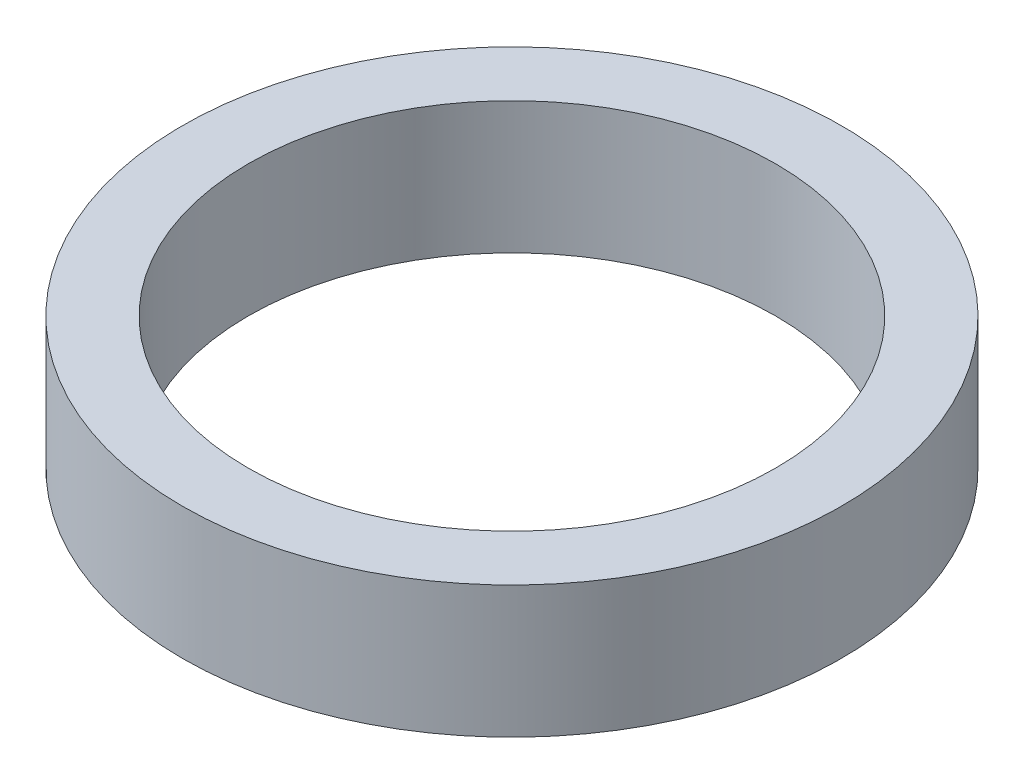
ISO-10303-21;
HEADER;
FILE_DESCRIPTION(('STEP AP214'),'2;1');
FILE_NAME('part.step','',(''),(''),'','','');
FILE_SCHEMA(('AUTOMOTIVE_DESIGN { 1 0 10303 214 1 1 1 1 }'));
ENDSEC;
DATA;
#1=APPLICATION_CONTEXT('core data for automotive mechanical design processes');
#2=APPLICATION_PROTOCOL_DEFINITION('international standard','automotive_design',2000,#1);
#3=PRODUCT_CONTEXT('',#1,'mechanical');
#4=PRODUCT('Part','Part','',(#3));
#5=PRODUCT_RELATED_PRODUCT_CATEGORY('part','',(#4));
#6=PRODUCT_DEFINITION_FORMATION('','',#4);
#7=PRODUCT_DEFINITION_CONTEXT('part definition',#1,'design');
#8=PRODUCT_DEFINITION('design','',#6,#7);
#9=PRODUCT_DEFINITION_SHAPE('','',#8);
#10=(LENGTH_UNIT() NAMED_UNIT(*) SI_UNIT(.MILLI.,.METRE.));
#11=(NAMED_UNIT(*) PLANE_ANGLE_UNIT() SI_UNIT($,.RADIAN.));
#12=(NAMED_UNIT(*) SI_UNIT($,.STERADIAN.) SOLID_ANGLE_UNIT());
#13=UNCERTAINTY_MEASURE_WITH_UNIT(LENGTH_MEASURE(1.E-05),#10,'distance_accuracy_value','');
#14=(GEOMETRIC_REPRESENTATION_CONTEXT(3) GLOBAL_UNCERTAINTY_ASSIGNED_CONTEXT((#13)) GLOBAL_UNIT_ASSIGNED_CONTEXT((#10,
#11,#12)) REPRESENTATION_CONTEXT('',''));
#15=CARTESIAN_POINT('',(0.,0.,0.));
#16=DIRECTION('',(0.,0.,1.));
#17=DIRECTION('',(1.,0.,0.));
#18=AXIS2_PLACEMENT_3D('',#15,#16,#17);
#19=CARTESIAN_POINT('',(0.,50.,200.));
#20=DIRECTION('',(0.,1.,0.));
#21=DIRECTION('',(0.,0.,1.));
#22=AXIS2_PLACEMENT_3D('',#19,#20,#21);
#23=PLANE('',#22);
#24=CARTESIAN_POINT('',(0.,50.,0.));
#25=DIRECTION('',(0.,1.,0.));
#26=DIRECTION('',(0.,0.,1.));
#27=AXIS2_PLACEMENT_3D('',#24,#25,#26);
#28=CIRCLE('',#27,250.);
#29=CARTESIAN_POINT('',(0.,50.,250.));
#30=VERTEX_POINT('',#29);
#31=EDGE_CURVE('E10',#30,#30,#28,.T.);
#32=ORIENTED_EDGE('',*,*,#31,.T.);
#33=EDGE_LOOP('',(#32));
#34=FACE_BOUND('',#33,.T.);
#35=CARTESIAN_POINT('',(0.,50.,0.));
#36=DIRECTION('',(0.,1.,0.));
#37=DIRECTION('',(0.,0.,1.));
#38=AXIS2_PLACEMENT_3D('',#35,#36,#37);
#39=CIRCLE('',#38,200.);
#40=CARTESIAN_POINT('',(0.,50.,200.));
#41=VERTEX_POINT('',#40);
#42=EDGE_CURVE('E54',#41,#41,#39,.T.);
#43=ORIENTED_EDGE('',*,*,#42,.F.);
#44=EDGE_LOOP('',(#43));
#45=FACE_BOUND('',#44,.T.);
#46=ADVANCED_FACE('F37',(#34,#45),#23,.T.);
#47=CARTESIAN_POINT('',(0.,174.427480916031,0.));
#48=DIRECTION('',(0.,1.,0.));
#49=DIRECTION('',(0.,0.,1.));
#50=AXIS2_PLACEMENT_3D('',#47,#48,#49);
#51=CYLINDRICAL_SURFACE('',#50,250.);
#52=CARTESIAN_POINT('',(0.,-50.,0.));
#53=DIRECTION('',(0.,1.,0.));
#54=DIRECTION('',(0.,0.,1.));
#55=AXIS2_PLACEMENT_3D('',#52,#53,#54);
#56=CIRCLE('',#55,250.);
#57=CARTESIAN_POINT('',(0.,-50.,250.));
#58=VERTEX_POINT('',#57);
#59=EDGE_CURVE('E44',#58,#58,#56,.T.);
#60=ORIENTED_EDGE('',*,*,#59,.T.);
#61=EDGE_LOOP('',(#60));
#62=FACE_BOUND('',#61,.T.);
#63=ORIENTED_EDGE('',*,*,#31,.F.);
#64=EDGE_LOOP('',(#63));
#65=FACE_BOUND('',#64,.T.);
#66=ADVANCED_FACE('F65',(#62,#65),#51,.T.);
#67=CARTESIAN_POINT('',(0.,-50.,250.));
#68=DIRECTION('',(0.,-1.,0.));
#69=DIRECTION('',(0.,0.,-1.));
#70=AXIS2_PLACEMENT_3D('',#67,#68,#69);
#71=PLANE('',#70);
#72=CARTESIAN_POINT('',(0.,-50.,0.));
#73=DIRECTION('',(0.,1.,0.));
#74=DIRECTION('',(0.,0.,1.));
#75=AXIS2_PLACEMENT_3D('',#72,#73,#74);
#76=CIRCLE('',#75,200.);
#77=CARTESIAN_POINT('',(0.,-50.,200.));
#78=VERTEX_POINT('',#77);
#79=EDGE_CURVE('E49',#78,#78,#76,.T.);
#80=ORIENTED_EDGE('',*,*,#79,.T.);
#81=EDGE_LOOP('',(#80));
#82=FACE_BOUND('',#81,.T.);
#83=ORIENTED_EDGE('',*,*,#59,.F.);
#84=EDGE_LOOP('',(#83));
#85=FACE_BOUND('',#84,.T.);
#86=ADVANCED_FACE('F69',(#82,#85),#71,.T.);
#87=CARTESIAN_POINT('',(0.,174.427480916031,0.));
#88=DIRECTION('',(0.,1.,0.));
#89=DIRECTION('',(0.,0.,1.));
#90=AXIS2_PLACEMENT_3D('',#87,#88,#89);
#91=CYLINDRICAL_SURFACE('',#90,200.);
#92=ORIENTED_EDGE('',*,*,#42,.T.);
#93=EDGE_LOOP('',(#92));
#94=FACE_BOUND('',#93,.T.);
#95=ORIENTED_EDGE('',*,*,#79,.F.);
#96=EDGE_LOOP('',(#95));
#97=FACE_BOUND('',#96,.T.);
#98=ADVANCED_FACE('F61',(#94,#97),#91,.F.);
#99=CLOSED_SHELL('',(#46,#66,#86,#98));
#100=MANIFOLD_SOLID_BREP('B2',#99);
#101=ADVANCED_BREP_SHAPE_REPRESENTATION('',(#18,#100),#14);
#102=SHAPE_DEFINITION_REPRESENTATION(#9,#101);
ENDSEC;
END-ISO-10303-21;
